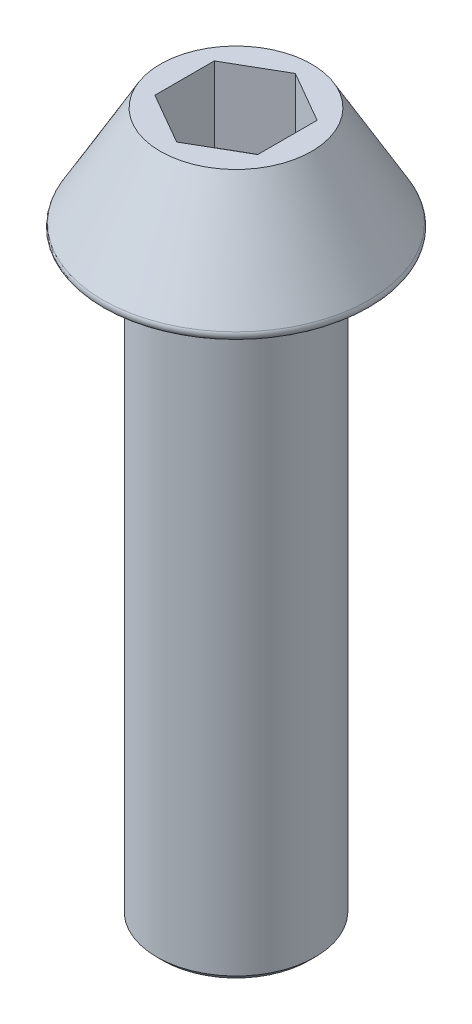
ISO-10303-21;
HEADER;
FILE_DESCRIPTION(('STEP AP214'),'2;1');
FILE_NAME('part.step','',(''),(''),'','','');
FILE_SCHEMA(('AUTOMOTIVE_DESIGN { 1 0 10303 214 1 1 1 1 }'));
ENDSEC;
DATA;
#1=APPLICATION_CONTEXT('core data for automotive mechanical design processes');
#2=APPLICATION_PROTOCOL_DEFINITION('international standard','automotive_design',2000,#1);
#3=PRODUCT_CONTEXT('',#1,'mechanical');
#4=PRODUCT('Part','Part','',(#3));
#5=PRODUCT_RELATED_PRODUCT_CATEGORY('part','',(#4));
#6=PRODUCT_DEFINITION_FORMATION('','',#4);
#7=PRODUCT_DEFINITION_CONTEXT('part definition',#1,'design');
#8=PRODUCT_DEFINITION('design','',#6,#7);
#9=PRODUCT_DEFINITION_SHAPE('','',#8);
#10=(LENGTH_UNIT() NAMED_UNIT(*) SI_UNIT(.MILLI.,.METRE.));
#11=(NAMED_UNIT(*) PLANE_ANGLE_UNIT() SI_UNIT($,.RADIAN.));
#12=(NAMED_UNIT(*) SI_UNIT($,.STERADIAN.) SOLID_ANGLE_UNIT());
#13=UNCERTAINTY_MEASURE_WITH_UNIT(LENGTH_MEASURE(1.E-05),#10,'distance_accuracy_value','');
#14=(GEOMETRIC_REPRESENTATION_CONTEXT(3) GLOBAL_UNCERTAINTY_ASSIGNED_CONTEXT((#13)) GLOBAL_UNIT_ASSIGNED_CONTEXT((#10,
#11,#12)) REPRESENTATION_CONTEXT('',''));
#15=CARTESIAN_POINT('',(0.,0.,0.));
#16=DIRECTION('',(0.,0.,1.));
#17=DIRECTION('',(1.,0.,0.));
#18=AXIS2_PLACEMENT_3D('',#15,#16,#17);
#19=CARTESIAN_POINT('',(0.,30.,0.));
#20=DIRECTION('',(0.,-1.,0.));
#21=DIRECTION('',(0.,0.,-1.));
#22=AXIS2_PLACEMENT_3D('',#19,#20,#21);
#23=CYLINDRICAL_SURFACE('',#22,4.);
#24=CARTESIAN_POINT('',(0.,0.300000000000005,0.));
#25=DIRECTION('',(0.,1.,0.));
#26=DIRECTION('',(0.,0.,1.));
#27=AXIS2_PLACEMENT_3D('',#24,#25,#26);
#28=CIRCLE('',#27,4.);
#29=CARTESIAN_POINT('',(0.,0.300000000000005,4.));
#30=VERTEX_POINT('',#29);
#31=EDGE_CURVE('E155',#30,#30,#28,.T.);
#32=ORIENTED_EDGE('',*,*,#31,.T.);
#33=EDGE_LOOP('',(#32));
#34=FACE_BOUND('',#33,.T.);
#35=CARTESIAN_POINT('',(0.,30.,0.));
#36=DIRECTION('',(0.,1.,0.));
#37=DIRECTION('',(0.,0.,1.));
#38=AXIS2_PLACEMENT_3D('',#35,#36,#37);
#39=CIRCLE('',#38,4.);
#40=CARTESIAN_POINT('',(0.,30.,4.));
#41=VERTEX_POINT('',#40);
#42=EDGE_CURVE('E152',#41,#41,#39,.T.);
#43=ORIENTED_EDGE('',*,*,#42,.F.);
#44=EDGE_LOOP('',(#43));
#45=FACE_BOUND('',#44,.T.);
#46=ADVANCED_FACE('F41',(#34,#45),#23,.T.);
#47=CARTESIAN_POINT('',(0.,0.,0.));
#48=DIRECTION('',(0.,1.,0.));
#49=DIRECTION('',(0.,0.,1.));
#50=AXIS2_PLACEMENT_3D('',#47,#48,#49);
#51=PLANE('',#50);
#52=CARTESIAN_POINT('',(0.,0.,0.));
#53=DIRECTION('',(0.,1.,0.));
#54=DIRECTION('',(0.,0.,1.));
#55=AXIS2_PLACEMENT_3D('',#52,#53,#54);
#56=CIRCLE('',#55,3.69999999999999);
#57=CARTESIAN_POINT('',(0.,0.,3.69999999999999));
#58=VERTEX_POINT('',#57);
#59=EDGE_CURVE('E158',#58,#58,#56,.F.);
#60=ORIENTED_EDGE('',*,*,#59,.T.);
#61=EDGE_LOOP('',(#60));
#62=FACE_BOUND('',#61,.T.);
#63=CARTESIAN_POINT('',(0.,0.,0.));
#64=DIRECTION('',(0.,-1.,0.));
#65=DIRECTION('',(0.,0.,-1.));
#66=AXIS2_PLACEMENT_3D('',#63,#64,#65);
#67=CIRCLE('',#66,2.65);
#68=CARTESIAN_POINT('',(0.,0.,-2.65));
#69=VERTEX_POINT('',#68);
#70=EDGE_CURVE('E226',#69,#69,#67,.T.);
#71=ORIENTED_EDGE('',*,*,#70,.F.);
#72=EDGE_LOOP('',(#71));
#73=FACE_BOUND('',#72,.T.);
#74=ADVANCED_FACE('F176',(#62,#73),#51,.F.);
#75=CARTESIAN_POINT('',(0.,30.,0.));
#76=DIRECTION('',(0.,1.,0.));
#77=DIRECTION('',(0.,0.,1.));
#78=AXIS2_PLACEMENT_3D('',#75,#76,#77);
#79=PLANE('',#78);
#80=CARTESIAN_POINT('',(0.,30.,0.));
#81=DIRECTION('',(0.,1.,0.));
#82=DIRECTION('',(0.,0.,1.));
#83=AXIS2_PLACEMENT_3D('',#80,#81,#82);
#84=CIRCLE('',#83,6.48038475772934);
#85=CARTESIAN_POINT('',(0.,30.,6.48038475772934));
#86=VERTEX_POINT('',#85);
#87=EDGE_CURVE('E11',#86,#86,#84,.F.);
#88=ORIENTED_EDGE('',*,*,#87,.T.);
#89=EDGE_LOOP('',(#88));
#90=FACE_BOUND('',#89,.T.);
#91=ORIENTED_EDGE('',*,*,#42,.T.);
#92=EDGE_LOOP('',(#91));
#93=FACE_BOUND('',#92,.T.);
#94=ADVANCED_FACE('F182',(#90,#93),#79,.F.);
#95=CARTESIAN_POINT('',(0.,30.,0.));
#96=DIRECTION('',(0.,-1.,0.));
#97=DIRECTION('',(0.,0.,1.));
#98=AXIS2_PLACEMENT_3D('',#95,#96,#97);
#99=CONICAL_SURFACE('',#98,7.,0.523598775598299);
#100=CARTESIAN_POINT('',(0.,30.45,0.));
#101=DIRECTION('',(0.,1.,0.));
#102=DIRECTION('',(0.,0.,1.));
#103=AXIS2_PLACEMENT_3D('',#100,#101,#102);
#104=CIRCLE('',#103,6.74019237886467);
#105=CARTESIAN_POINT('',(0.,30.45,6.74019237886467));
#106=VERTEX_POINT('',#105);
#107=EDGE_CURVE('E49',#106,#106,#104,.T.);
#108=ORIENTED_EDGE('',*,*,#107,.T.);
#109=EDGE_LOOP('',(#108));
#110=FACE_BOUND('',#109,.T.);
#111=CARTESIAN_POINT('',(0.,35.5,0.));
#112=DIRECTION('',(0.,1.,0.));
#113=DIRECTION('',(0.,0.,1.));
#114=AXIS2_PLACEMENT_3D('',#111,#112,#113);
#115=CIRCLE('',#114,3.82457351945706);
#116=CARTESIAN_POINT('',(0.,35.5,3.82457351945706));
#117=VERTEX_POINT('',#116);
#118=EDGE_CURVE('E144',#117,#117,#115,.T.);
#119=ORIENTED_EDGE('',*,*,#118,.F.);
#120=EDGE_LOOP('',(#119));
#121=FACE_BOUND('',#120,.T.);
#122=ADVANCED_FACE('F163',(#110,#121),#99,.T.);
#123=CARTESIAN_POINT('',(0.,35.5,0.));
#124=DIRECTION('',(0.,1.,0.));
#125=DIRECTION('',(0.,0.,1.));
#126=AXIS2_PLACEMENT_3D('',#123,#124,#125);
#127=PLANE('',#126);
#128=DIRECTION('',(-0.866025403784439,0.,-0.5));
#129=VECTOR('',#128,1.);
#130=CARTESIAN_POINT('',(2.6,35.5,-1.50111069989303));
#131=LINE('',#130,#129);
#132=CARTESIAN_POINT('',(2.6,35.5,-1.50111069989303));
#133=VERTEX_POINT('',#132);
#134=CARTESIAN_POINT('',(0.,35.5,-3.00222139978605));
#135=VERTEX_POINT('',#134);
#136=EDGE_CURVE('E56',#133,#135,#131,.T.);
#137=ORIENTED_EDGE('',*,*,#136,.F.);
#138=DIRECTION('',(0.,0.,-1.));
#139=VECTOR('',#138,1.);
#140=CARTESIAN_POINT('',(2.6,35.5,1.50111069989303));
#141=LINE('',#140,#139);
#142=CARTESIAN_POINT('',(2.6,35.5,1.50111069989303));
#143=VERTEX_POINT('',#142);
#144=EDGE_CURVE('E140',#143,#133,#141,.T.);
#145=ORIENTED_EDGE('',*,*,#144,.F.);
#146=DIRECTION('',(0.866025403784439,0.,-0.5));
#147=VECTOR('',#146,1.);
#148=CARTESIAN_POINT('',(0.,35.5,3.00222139978605));
#149=LINE('',#148,#147);
#150=CARTESIAN_POINT('',(0.,35.5,3.00222139978605));
#151=VERTEX_POINT('',#150);
#152=EDGE_CURVE('E138',#151,#143,#149,.T.);
#153=ORIENTED_EDGE('',*,*,#152,.F.);
#154=DIRECTION('',(0.866025403784439,0.,0.5));
#155=VECTOR('',#154,1.);
#156=CARTESIAN_POINT('',(-2.6,35.5,1.50111069989303));
#157=LINE('',#156,#155);
#158=CARTESIAN_POINT('',(-2.6,35.5,1.50111069989303));
#159=VERTEX_POINT('',#158);
#160=EDGE_CURVE('E104',#159,#151,#157,.T.);
#161=ORIENTED_EDGE('',*,*,#160,.F.);
#162=DIRECTION('',(0.,0.,1.));
#163=VECTOR('',#162,1.);
#164=CARTESIAN_POINT('',(-2.6,35.5,-1.50111069989303));
#165=LINE('',#164,#163);
#166=CARTESIAN_POINT('',(-2.6,35.5,-1.50111069989303));
#167=VERTEX_POINT('',#166);
#168=EDGE_CURVE('E134',#167,#159,#165,.T.);
#169=ORIENTED_EDGE('',*,*,#168,.F.);
#170=DIRECTION('',(-0.866025403784439,0.,0.5));
#171=VECTOR('',#170,1.);
#172=CARTESIAN_POINT('',(0.,35.5,-3.00222139978606));
#173=LINE('',#172,#171);
#174=EDGE_CURVE('E130',#135,#167,#173,.T.);
#175=ORIENTED_EDGE('',*,*,#174,.F.);
#176=EDGE_LOOP('',(#137,#145,#153,#161,#169,#175));
#177=FACE_BOUND('',#176,.T.);
#178=ORIENTED_EDGE('',*,*,#118,.T.);
#179=EDGE_LOOP('',(#178));
#180=FACE_BOUND('',#179,.T.);
#181=ADVANCED_FACE('F189',(#177,#180),#127,.T.);
#182=CARTESIAN_POINT('',(2.6,31.7,-1.50111069989303));
#183=DIRECTION('',(0.5,0.,-0.866025403784439));
#184=DIRECTION('',(-0.866025403784439,0.,-0.5));
#185=AXIS2_PLACEMENT_3D('',#182,#183,#184);
#186=PLANE('',#185);
#187=ORIENTED_EDGE('',*,*,#136,.T.);
#188=DIRECTION('',(0.,1.,0.));
#189=VECTOR('',#188,1.);
#190=CARTESIAN_POINT('',(0.,31.7,-3.00222139978606));
#191=LINE('',#190,#189);
#192=CARTESIAN_POINT('',(0.,31.7,-3.00222139978606));
#193=VERTEX_POINT('',#192);
#194=EDGE_CURVE('E86',#193,#135,#191,.T.);
#195=ORIENTED_EDGE('',*,*,#194,.F.);
#196=DIRECTION('',(-0.866025403784439,0.,-0.5));
#197=VECTOR('',#196,1.);
#198=CARTESIAN_POINT('',(2.6,31.7,-1.50111069989303));
#199=LINE('',#198,#197);
#200=CARTESIAN_POINT('',(2.6,31.7,-1.50111069989303));
#201=VERTEX_POINT('',#200);
#202=EDGE_CURVE('E142',#201,#193,#199,.T.);
#203=ORIENTED_EDGE('',*,*,#202,.F.);
#204=DIRECTION('',(0.,1.,0.));
#205=VECTOR('',#204,1.);
#206=CARTESIAN_POINT('',(2.6,31.7,-1.50111069989303));
#207=LINE('',#206,#205);
#208=EDGE_CURVE('E64',#201,#133,#207,.T.);
#209=ORIENTED_EDGE('',*,*,#208,.T.);
#210=EDGE_LOOP('',(#187,#195,#203,#209));
#211=FACE_BOUND('',#210,.T.);
#212=ADVANCED_FACE('F195',(#211),#186,.F.);
#213=CARTESIAN_POINT('',(2.6,31.7,1.50111069989303));
#214=DIRECTION('',(1.,0.,0.));
#215=DIRECTION('',(0.,0.,-1.));
#216=AXIS2_PLACEMENT_3D('',#213,#214,#215);
#217=PLANE('',#216);
#218=ORIENTED_EDGE('',*,*,#144,.T.);
#219=ORIENTED_EDGE('',*,*,#208,.F.);
#220=DIRECTION('',(0.,0.,-1.));
#221=VECTOR('',#220,1.);
#222=CARTESIAN_POINT('',(2.6,31.7,1.50111069989303));
#223=LINE('',#222,#221);
#224=CARTESIAN_POINT('',(2.6,31.7,1.50111069989303));
#225=VERTEX_POINT('',#224);
#226=EDGE_CURVE('E116',#225,#201,#223,.T.);
#227=ORIENTED_EDGE('',*,*,#226,.F.);
#228=DIRECTION('',(0.,1.,0.));
#229=VECTOR('',#228,1.);
#230=CARTESIAN_POINT('',(2.6,31.7,1.50111069989303));
#231=LINE('',#230,#229);
#232=EDGE_CURVE('E108',#225,#143,#231,.T.);
#233=ORIENTED_EDGE('',*,*,#232,.T.);
#234=EDGE_LOOP('',(#218,#219,#227,#233));
#235=FACE_BOUND('',#234,.T.);
#236=ADVANCED_FACE('F199',(#235),#217,.F.);
#237=CARTESIAN_POINT('',(0.,31.7,3.00222139978605));
#238=DIRECTION('',(0.5,0.,0.866025403784439));
#239=DIRECTION('',(0.866025403784439,0.,-0.5));
#240=AXIS2_PLACEMENT_3D('',#237,#238,#239);
#241=PLANE('',#240);
#242=ORIENTED_EDGE('',*,*,#152,.T.);
#243=ORIENTED_EDGE('',*,*,#232,.F.);
#244=DIRECTION('',(0.866025403784439,0.,-0.5));
#245=VECTOR('',#244,1.);
#246=CARTESIAN_POINT('',(0.,31.7,3.00222139978605));
#247=LINE('',#246,#245);
#248=CARTESIAN_POINT('',(0.,31.7,3.00222139978605));
#249=VERTEX_POINT('',#248);
#250=EDGE_CURVE('E112',#249,#225,#247,.T.);
#251=ORIENTED_EDGE('',*,*,#250,.F.);
#252=DIRECTION('',(0.,1.,0.));
#253=VECTOR('',#252,1.);
#254=CARTESIAN_POINT('',(0.,31.7,3.00222139978605));
#255=LINE('',#254,#253);
#256=EDGE_CURVE('E97',#249,#151,#255,.T.);
#257=ORIENTED_EDGE('',*,*,#256,.T.);
#258=EDGE_LOOP('',(#242,#243,#251,#257));
#259=FACE_BOUND('',#258,.T.);
#260=ADVANCED_FACE('F113',(#259),#241,.F.);
#261=CARTESIAN_POINT('',(-2.6,31.7,1.50111069989303));
#262=DIRECTION('',(-0.5,0.,0.866025403784438));
#263=DIRECTION('',(0.866025403784439,0.,0.5));
#264=AXIS2_PLACEMENT_3D('',#261,#262,#263);
#265=PLANE('',#264);
#266=ORIENTED_EDGE('',*,*,#160,.T.);
#267=ORIENTED_EDGE('',*,*,#256,.F.);
#268=DIRECTION('',(0.866025403784439,0.,0.5));
#269=VECTOR('',#268,1.);
#270=CARTESIAN_POINT('',(-2.6,31.7,1.50111069989303));
#271=LINE('',#270,#269);
#272=CARTESIAN_POINT('',(-2.6,31.7,1.50111069989303));
#273=VERTEX_POINT('',#272);
#274=EDGE_CURVE('E101',#273,#249,#271,.T.);
#275=ORIENTED_EDGE('',*,*,#274,.F.);
#276=DIRECTION('',(0.,1.,0.));
#277=VECTOR('',#276,1.);
#278=CARTESIAN_POINT('',(-2.6,31.7,1.50111069989303));
#279=LINE('',#278,#277);
#280=EDGE_CURVE('E109',#273,#159,#279,.T.);
#281=ORIENTED_EDGE('',*,*,#280,.T.);
#282=EDGE_LOOP('',(#266,#267,#275,#281));
#283=FACE_BOUND('',#282,.T.);
#284=ADVANCED_FACE('F99',(#283),#265,.F.);
#285=CARTESIAN_POINT('',(-2.6,31.7,-1.50111069989303));
#286=DIRECTION('',(-1.,0.,0.));
#287=DIRECTION('',(0.,0.,1.));
#288=AXIS2_PLACEMENT_3D('',#285,#286,#287);
#289=PLANE('',#288);
#290=ORIENTED_EDGE('',*,*,#168,.T.);
#291=ORIENTED_EDGE('',*,*,#280,.F.);
#292=DIRECTION('',(0.,0.,1.));
#293=VECTOR('',#292,1.);
#294=CARTESIAN_POINT('',(-2.6,31.7,-1.50111069989303));
#295=LINE('',#294,#293);
#296=CARTESIAN_POINT('',(-2.6,31.7,-1.50111069989303));
#297=VERTEX_POINT('',#296);
#298=EDGE_CURVE('E122',#297,#273,#295,.T.);
#299=ORIENTED_EDGE('',*,*,#298,.F.);
#300=DIRECTION('',(0.,1.,0.));
#301=VECTOR('',#300,1.);
#302=CARTESIAN_POINT('',(-2.6,31.7,-1.50111069989303));
#303=LINE('',#302,#301);
#304=EDGE_CURVE('E147',#297,#167,#303,.T.);
#305=ORIENTED_EDGE('',*,*,#304,.T.);
#306=EDGE_LOOP('',(#290,#291,#299,#305));
#307=FACE_BOUND('',#306,.T.);
#308=ADVANCED_FACE('F203',(#307),#289,.F.);
#309=CARTESIAN_POINT('',(0.,31.7,-3.00222139978606));
#310=DIRECTION('',(-0.5,0.,-0.866025403784439));
#311=DIRECTION('',(-0.866025403784439,0.,0.5));
#312=AXIS2_PLACEMENT_3D('',#309,#310,#311);
#313=PLANE('',#312);
#314=ORIENTED_EDGE('',*,*,#174,.T.);
#315=ORIENTED_EDGE('',*,*,#304,.F.);
#316=DIRECTION('',(-0.866025403784439,0.,0.5));
#317=VECTOR('',#316,1.);
#318=CARTESIAN_POINT('',(0.,31.7,-3.00222139978606));
#319=LINE('',#318,#317);
#320=EDGE_CURVE('E124',#193,#297,#319,.T.);
#321=ORIENTED_EDGE('',*,*,#320,.F.);
#322=ORIENTED_EDGE('',*,*,#194,.T.);
#323=EDGE_LOOP('',(#314,#315,#321,#322));
#324=FACE_BOUND('',#323,.T.);
#325=ADVANCED_FACE('F200',(#324),#313,.F.);
#326=CARTESIAN_POINT('',(0.,31.7,-3.00222139978605));
#327=DIRECTION('',(0.,1.,0.));
#328=DIRECTION('',(0.,0.,1.));
#329=AXIS2_PLACEMENT_3D('',#326,#327,#328);
#330=PLANE('',#329);
#331=ORIENTED_EDGE('',*,*,#202,.T.);
#332=ORIENTED_EDGE('',*,*,#320,.T.);
#333=ORIENTED_EDGE('',*,*,#298,.T.);
#334=ORIENTED_EDGE('',*,*,#274,.T.);
#335=ORIENTED_EDGE('',*,*,#250,.T.);
#336=ORIENTED_EDGE('',*,*,#226,.T.);
#337=EDGE_LOOP('',(#331,#332,#333,#334,#335,#336));
#338=FACE_BOUND('',#337,.T.);
#339=ADVANCED_FACE('F119',(#338),#330,.T.);
#340=CARTESIAN_POINT('',(0.,22.,0.));
#341=DIRECTION('',(0.,-1.,0.));
#342=DIRECTION('',(0.,0.,-1.));
#343=AXIS2_PLACEMENT_3D('',#340,#341,#342);
#344=CYLINDRICAL_SURFACE('',#343,2.65);
#345=CARTESIAN_POINT('',(0.,22.,0.));
#346=DIRECTION('',(0.,-1.,0.));
#347=DIRECTION('',(0.,0.,-1.));
#348=AXIS2_PLACEMENT_3D('',#345,#346,#347);
#349=CIRCLE('',#348,2.65);
#350=CARTESIAN_POINT('',(0.,22.,-2.65));
#351=VERTEX_POINT('',#350);
#352=EDGE_CURVE('E131',#351,#351,#349,.T.);
#353=ORIENTED_EDGE('',*,*,#352,.F.);
#354=EDGE_LOOP('',(#353));
#355=FACE_BOUND('',#354,.T.);
#356=ORIENTED_EDGE('',*,*,#70,.T.);
#357=EDGE_LOOP('',(#356));
#358=FACE_BOUND('',#357,.T.);
#359=ADVANCED_FACE('F216',(#355,#358),#344,.F.);
#360=CARTESIAN_POINT('',(0.,22.,0.));
#361=DIRECTION('',(0.,-1.,0.));
#362=DIRECTION('',(0.,0.,-1.));
#363=AXIS2_PLACEMENT_3D('',#360,#361,#362);
#364=PLANE('',#363);
#365=ORIENTED_EDGE('',*,*,#352,.T.);
#366=EDGE_LOOP('',(#365));
#367=FACE_BOUND('',#366,.T.);
#368=ADVANCED_FACE('F172',(#367),#364,.T.);
#369=CARTESIAN_POINT('',(0.,0.300000000000005,0.));
#370=DIRECTION('',(0.,1.,0.));
#371=DIRECTION('',(0.,0.,1.));
#372=AXIS2_PLACEMENT_3D('',#369,#370,#371);
#373=CONICAL_SURFACE('',#372,4.,0.785398163397448);
#374=CARTESIAN_POINT('',(0.,0.,3.69999999999999));
#375=CARTESIAN_POINT('',(0.,0.00312500000000006,3.703125));
#376=CARTESIAN_POINT('',(0.,0.0062500000000001,3.70624999999999));
#377=CARTESIAN_POINT('',(0.,0.0125000000000002,3.7125));
#378=CARTESIAN_POINT('',(0.,0.0156250000000002,3.71562499999999));
#379=CARTESIAN_POINT('',(0.,0.0218750000000003,3.72187499999999));
#380=CARTESIAN_POINT('',(0.,0.0250000000000004,3.725));
#381=CARTESIAN_POINT('',(0.,0.0312500000000005,3.73125));
#382=CARTESIAN_POINT('',(0.,0.0343750000000005,3.734375));
#383=CARTESIAN_POINT('',(0.,0.0406250000000006,3.740625));
#384=CARTESIAN_POINT('',(0.,0.0437500000000006,3.74375));
#385=CARTESIAN_POINT('',(0.,0.0500000000000008,3.75));
#386=CARTESIAN_POINT('',(0.,0.0531250000000009,3.753125));
#387=CARTESIAN_POINT('',(0.,0.059375000000001,3.759375));
#388=CARTESIAN_POINT('',(0.,0.062500000000001,3.7625));
#389=CARTESIAN_POINT('',(0.,0.0687500000000011,3.76875));
#390=CARTESIAN_POINT('',(0.,0.0718750000000011,3.771875));
#391=CARTESIAN_POINT('',(0.,0.0781250000000012,3.778125));
#392=CARTESIAN_POINT('',(0.,0.0812500000000013,3.78125));
#393=CARTESIAN_POINT('',(0.,0.0875000000000015,3.7875));
#394=CARTESIAN_POINT('',(0.,0.0906250000000015,3.790625));
#395=CARTESIAN_POINT('',(0.,0.0968750000000016,3.796875));
#396=CARTESIAN_POINT('',(0.,0.100000000000002,3.8));
#397=CARTESIAN_POINT('',(0.,0.106250000000002,3.80625));
#398=CARTESIAN_POINT('',(0.,0.109375000000002,3.809375));
#399=CARTESIAN_POINT('',(0.,0.115625000000002,3.815625));
#400=CARTESIAN_POINT('',(0.,0.118750000000002,3.81875));
#401=CARTESIAN_POINT('',(0.,0.125000000000002,3.825));
#402=CARTESIAN_POINT('',(0.,0.128125000000002,3.828125));
#403=CARTESIAN_POINT('',(0.,0.134375000000002,3.834375));
#404=CARTESIAN_POINT('',(0.,0.137500000000002,3.8375));
#405=CARTESIAN_POINT('',(0.,0.143750000000002,3.84375));
#406=CARTESIAN_POINT('',(0.,0.146875000000002,3.846875));
#407=CARTESIAN_POINT('',(0.,0.153125000000003,3.853125));
#408=CARTESIAN_POINT('',(0.,0.156250000000003,3.85625));
#409=CARTESIAN_POINT('',(0.,0.162500000000003,3.8625));
#410=CARTESIAN_POINT('',(0.,0.165625000000003,3.865625));
#411=CARTESIAN_POINT('',(0.,0.171875000000003,3.871875));
#412=CARTESIAN_POINT('',(0.,0.175000000000003,3.875));
#413=CARTESIAN_POINT('',(0.,0.181250000000003,3.88125));
#414=CARTESIAN_POINT('',(0.,0.184375000000003,3.884375));
#415=CARTESIAN_POINT('',(0.,0.190625000000003,3.890625));
#416=CARTESIAN_POINT('',(0.,0.193750000000003,3.89375));
#417=CARTESIAN_POINT('',(0.,0.200000000000003,3.9));
#418=CARTESIAN_POINT('',(0.,0.203125000000003,3.903125));
#419=CARTESIAN_POINT('',(0.,0.209375000000004,3.909375));
#420=CARTESIAN_POINT('',(0.,0.212500000000004,3.9125));
#421=CARTESIAN_POINT('',(0.,0.218750000000004,3.91875));
#422=CARTESIAN_POINT('',(0.,0.221875000000004,3.921875));
#423=CARTESIAN_POINT('',(0.,0.228125000000004,3.928125));
#424=CARTESIAN_POINT('',(0.,0.231250000000004,3.93125));
#425=CARTESIAN_POINT('',(0.,0.237500000000004,3.9375));
#426=CARTESIAN_POINT('',(0.,0.240625000000004,3.940625));
#427=CARTESIAN_POINT('',(0.,0.246875000000004,3.946875));
#428=CARTESIAN_POINT('',(0.,0.250000000000004,3.95));
#429=CARTESIAN_POINT('',(0.,0.256250000000004,3.95625));
#430=CARTESIAN_POINT('',(0.,0.259375000000005,3.959375));
#431=CARTESIAN_POINT('',(0.,0.265625000000004,3.965625));
#432=CARTESIAN_POINT('',(0.,0.268750000000004,3.96875));
#433=CARTESIAN_POINT('',(0.,0.275000000000005,3.975));
#434=CARTESIAN_POINT('',(0.,0.278125000000005,3.978125));
#435=CARTESIAN_POINT('',(0.,0.284375000000005,3.984375));
#436=CARTESIAN_POINT('',(0.,0.287500000000005,3.9875));
#437=CARTESIAN_POINT('',(0.,0.293750000000005,3.99375));
#438=CARTESIAN_POINT('',(0.,0.296875000000005,3.996875));
#439=CARTESIAN_POINT('',(0.,0.300000000000005,4.));
#440=B_SPLINE_CURVE_WITH_KNOTS('',3,(#374,#375,#376,#377,#378,#379,#380,#381,#382,#383,#384,
#385,#386,#387,#388,#389,#390,#391,#392,#393,#394,#395,#396,#397,#398,#399,#400,#401,#402,#403,
#404,#405,#406,#407,#408,#409,#410,#411,#412,#413,#414,#415,#416,#417,#418,#419,#420,#421,#422,
#423,#424,#425,#426,#427,#428,#429,#430,#431,#432,#433,#434,#435,#436,#437,#438,#439),
.UNSPECIFIED.,.F.,.F.,(4,2,2,2,2,2,2,2,2,2,2,2,2,2,2,2,2,2,2,2,2,2,2,2,2,2,2,2,2,2,2,2,4),(0.,
0.0132582521472478,0.0265165042944958,0.0397747564417439,0.053033008588992,0.06629126073624,
0.0795495128834878,0.0928077650307358,0.106066017177984,0.119324269325232,0.13258252147248,
0.145840773619728,0.159099025766976,0.172357277914224,0.185615530061472,0.19887378220872,
0.212132034355968,0.225390286503216,0.238648538650464,0.251906790797712,0.26516504294496,
0.278423295092208,0.291681547239456,0.304939799386704,0.318198051533952,0.3314563036812,
0.344714555828448,0.357972807975696,0.371231060122944,0.384489312270192,0.39774756441744,
0.411005816564688,0.424264068711936),.UNSPECIFIED.);
#441=EDGE_CURVE('BSEAM167',#58,#30,#440,.T.);
#442=ORIENTED_EDGE('',*,*,#59,.F.);
#443=ORIENTED_EDGE('',*,*,#31,.F.);
#444=ORIENTED_EDGE('',*,*,#441,.T.);
#445=ORIENTED_EDGE('',*,*,#441,.F.);
#446=EDGE_LOOP('',(#442,#444,#443,#445));
#447=FACE_BOUND('',#446,.T.);
#448=ADVANCED_FACE('F167',(#447),#373,.T.);
#449=CARTESIAN_POINT('',(0.,30.3,0.));
#450=DIRECTION('',(0.,1.,0.));
#451=DIRECTION('',(0.,0.,1.));
#452=AXIS2_PLACEMENT_3D('',#449,#450,#451);
#453=TOROIDAL_SURFACE('',#452,6.48038475772934,0.3);
#454=ORIENTED_EDGE('',*,*,#87,.F.);
#455=EDGE_LOOP('',(#454));
#456=FACE_BOUND('',#455,.T.);
#457=ORIENTED_EDGE('',*,*,#107,.F.);
#458=EDGE_LOOP('',(#457));
#459=FACE_BOUND('',#458,.T.);
#460=ADVANCED_FACE('F43',(#456,#459),#453,.T.);
#461=CLOSED_SHELL('',(#46,#74,#94,#122,#181,#212,#236,#260,#284,#308,#325,#339,#359,#368,#448,#460));
#462=MANIFOLD_SOLID_BREP('B2',#461);
#463=ADVANCED_BREP_SHAPE_REPRESENTATION('',(#18,#462),#14);
#464=SHAPE_DEFINITION_REPRESENTATION(#9,#463);
ENDSEC;
END-ISO-10303-21;
